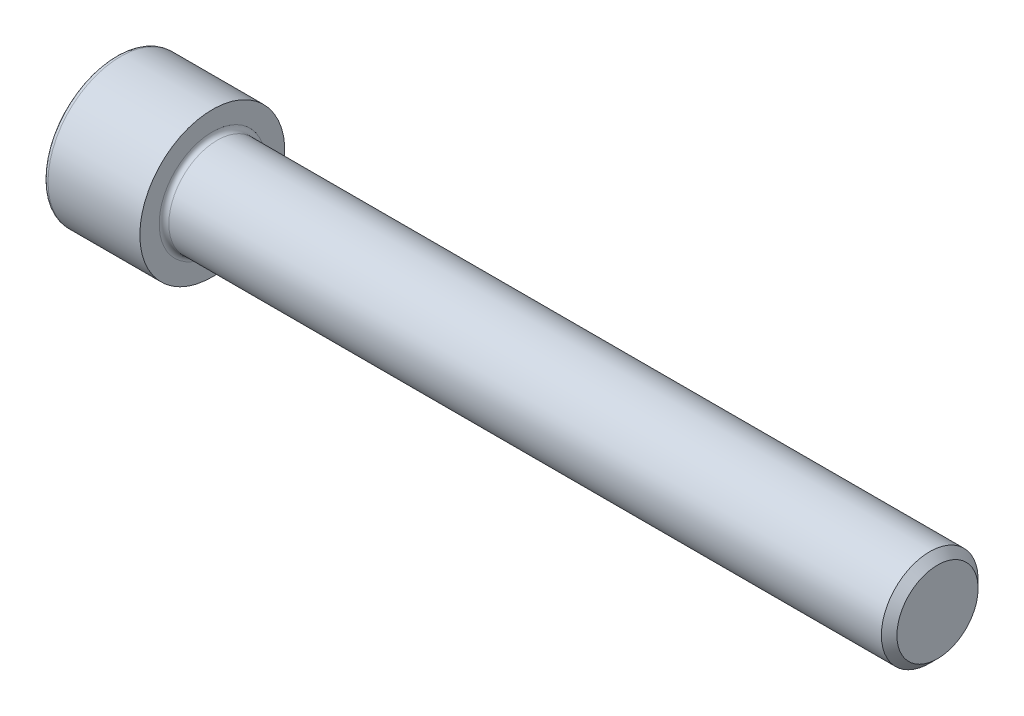
ISO-10303-21;
HEADER;
FILE_DESCRIPTION(('STEP AP214'),'2;1');
FILE_NAME('part.step','',(''),(''),'','','');
FILE_SCHEMA(('AUTOMOTIVE_DESIGN { 1 0 10303 214 1 1 1 1 }'));
ENDSEC;
DATA;
#1=APPLICATION_CONTEXT('core data for automotive mechanical design processes');
#2=APPLICATION_PROTOCOL_DEFINITION('international standard','automotive_design',2000,#1);
#3=PRODUCT_CONTEXT('',#1,'mechanical');
#4=PRODUCT('Part','Part','',(#3));
#5=PRODUCT_RELATED_PRODUCT_CATEGORY('part','',(#4));
#6=PRODUCT_DEFINITION_FORMATION('','',#4);
#7=PRODUCT_DEFINITION_CONTEXT('part definition',#1,'design');
#8=PRODUCT_DEFINITION('design','',#6,#7);
#9=PRODUCT_DEFINITION_SHAPE('','',#8);
#10=(LENGTH_UNIT() NAMED_UNIT(*) SI_UNIT(.MILLI.,.METRE.));
#11=(NAMED_UNIT(*) PLANE_ANGLE_UNIT() SI_UNIT($,.RADIAN.));
#12=(NAMED_UNIT(*) SI_UNIT($,.STERADIAN.) SOLID_ANGLE_UNIT());
#13=UNCERTAINTY_MEASURE_WITH_UNIT(LENGTH_MEASURE(1.E-05),#10,'distance_accuracy_value','');
#14=(GEOMETRIC_REPRESENTATION_CONTEXT(3) GLOBAL_UNCERTAINTY_ASSIGNED_CONTEXT((#13)) GLOBAL_UNIT_ASSIGNED_CONTEXT((#10,
#11,#12)) REPRESENTATION_CONTEXT('',''));
#15=CARTESIAN_POINT('',(0.,0.,0.));
#16=DIRECTION('',(0.,0.,1.));
#17=DIRECTION('',(1.,0.,0.));
#18=AXIS2_PLACEMENT_3D('',#15,#16,#17);
#19=CARTESIAN_POINT('',(0.,0.,0.));
#20=DIRECTION('',(-1.,0.,0.));
#21=DIRECTION('',(0.,0.,1.));
#22=AXIS2_PLACEMENT_3D('',#19,#20,#21);
#23=PLANE('',#22);
#24=DIRECTION('',(0.,-0.499999999999999,0.866025403784439));
#25=VECTOR('',#24,1.);
#26=CARTESIAN_POINT('',(0.,5.83989797285306,0.));
#27=LINE('',#26,#25);
#28=CARTESIAN_POINT('',(0.,5.83989797285306,0.));
#29=VERTEX_POINT('',#28);
#30=CARTESIAN_POINT('',(0.,2.91994898642653,5.0575));
#31=VERTEX_POINT('',#30);
#32=EDGE_CURVE('E259',#29,#31,#27,.T.);
#33=ORIENTED_EDGE('',*,*,#32,.T.);
#34=DIRECTION('',(0.,1.,0.));
#35=VECTOR('',#34,1.);
#36=CARTESIAN_POINT('',(0.,-2.91994898642653,5.0575));
#37=LINE('',#36,#35);
#38=CARTESIAN_POINT('',(0.,-2.91994898642653,5.0575));
#39=VERTEX_POINT('',#38);
#40=EDGE_CURVE('E131',#39,#31,#37,.T.);
#41=ORIENTED_EDGE('',*,*,#40,.F.);
#42=DIRECTION('',(0.,-0.500000000000001,-0.866025403784438));
#43=VECTOR('',#42,1.);
#44=CARTESIAN_POINT('',(0.,-2.91994898642653,5.0575));
#45=LINE('',#44,#43);
#46=CARTESIAN_POINT('',(0.,-5.83989797285307,0.));
#47=VERTEX_POINT('',#46);
#48=EDGE_CURVE('E262',#39,#47,#45,.T.);
#49=ORIENTED_EDGE('',*,*,#48,.T.);
#50=DIRECTION('',(0.,0.499999999999999,-0.866025403784439));
#51=VECTOR('',#50,1.);
#52=CARTESIAN_POINT('',(0.,-5.83989797285307,0.));
#53=LINE('',#52,#51);
#54=CARTESIAN_POINT('',(0.,-2.91994898642654,-5.0575));
#55=VERTEX_POINT('',#54);
#56=EDGE_CURVE('E265',#47,#55,#53,.T.);
#57=ORIENTED_EDGE('',*,*,#56,.T.);
#58=DIRECTION('',(0.,-1.,0.));
#59=VECTOR('',#58,1.);
#60=CARTESIAN_POINT('',(0.,2.91994898642652,-5.0575));
#61=LINE('',#60,#59);
#62=CARTESIAN_POINT('',(0.,2.91994898642652,-5.0575));
#63=VERTEX_POINT('',#62);
#64=EDGE_CURVE('E268',#63,#55,#61,.T.);
#65=ORIENTED_EDGE('',*,*,#64,.F.);
#66=DIRECTION('',(0.,-0.500000000000001,-0.866025403784438));
#67=VECTOR('',#66,1.);
#68=CARTESIAN_POINT('',(0.,5.83989797285306,0.));
#69=LINE('',#68,#67);
#70=EDGE_CURVE('E126',#29,#63,#69,.T.);
#71=ORIENTED_EDGE('',*,*,#70,.F.);
#72=EDGE_LOOP('',(#33,#41,#49,#57,#65,#71));
#73=FACE_BOUND('',#72,.T.);
#74=CARTESIAN_POINT('',(0.,0.,0.));
#75=DIRECTION('',(-1.,0.,0.));
#76=DIRECTION('',(0.,0.,1.));
#77=AXIS2_PLACEMENT_3D('',#74,#75,#76);
#78=CIRCLE('',#77,8.4);
#79=CARTESIAN_POINT('',(0.,0.,8.4));
#80=VERTEX_POINT('',#79);
#81=EDGE_CURVE('E43',#80,#80,#78,.T.);
#82=ORIENTED_EDGE('',*,*,#81,.T.);
#83=EDGE_LOOP('',(#82));
#84=FACE_BOUND('',#83,.T.);
#85=ADVANCED_FACE('F35',(#73,#84),#23,.T.);
#86=CARTESIAN_POINT('',(-31.75,0.,0.));
#87=DIRECTION('',(-1.,0.,0.));
#88=DIRECTION('',(0.,0.,1.));
#89=AXIS2_PLACEMENT_3D('',#86,#87,#88);
#90=CYLINDRICAL_SURFACE('',#89,9.);
#91=CARTESIAN_POINT('',(0.600000000000003,0.,0.));
#92=DIRECTION('',(-1.,0.,0.));
#93=DIRECTION('',(0.,0.,1.));
#94=AXIS2_PLACEMENT_3D('',#91,#92,#93);
#95=CIRCLE('',#94,9.);
#96=CARTESIAN_POINT('',(0.600000000000003,0.,9.));
#97=VERTEX_POINT('',#96);
#98=EDGE_CURVE('E11',#97,#97,#95,.F.);
#99=ORIENTED_EDGE('',*,*,#98,.T.);
#100=EDGE_LOOP('',(#99));
#101=FACE_BOUND('',#100,.T.);
#102=CARTESIAN_POINT('',(12.,0.,0.));
#103=DIRECTION('',(-1.,0.,0.));
#104=DIRECTION('',(0.,0.,1.));
#105=AXIS2_PLACEMENT_3D('',#102,#103,#104);
#106=CIRCLE('',#105,9.);
#107=CARTESIAN_POINT('',(12.,0.,9.));
#108=VERTEX_POINT('',#107);
#109=EDGE_CURVE('E149',#108,#108,#106,.T.);
#110=ORIENTED_EDGE('',*,*,#109,.T.);
#111=EDGE_LOOP('',(#110));
#112=FACE_BOUND('',#111,.T.);
#113=ADVANCED_FACE('F173',(#101,#112),#90,.T.);
#114=CARTESIAN_POINT('',(12.,9.,0.));
#115=DIRECTION('',(1.,0.,0.));
#116=DIRECTION('',(0.,0.,-1.));
#117=AXIS2_PLACEMENT_3D('',#114,#115,#116);
#118=PLANE('',#117);
#119=CARTESIAN_POINT('',(12.,0.,0.));
#120=DIRECTION('',(1.,0.,0.));
#121=DIRECTION('',(0.,0.,-1.));
#122=AXIS2_PLACEMENT_3D('',#119,#120,#121);
#123=CIRCLE('',#122,6.6);
#124=CARTESIAN_POINT('',(12.,0.,-6.6));
#125=VERTEX_POINT('',#124);
#126=EDGE_CURVE('E152',#125,#125,#123,.F.);
#127=ORIENTED_EDGE('',*,*,#126,.T.);
#128=EDGE_LOOP('',(#127));
#129=FACE_BOUND('',#128,.T.);
#130=ORIENTED_EDGE('',*,*,#109,.F.);
#131=EDGE_LOOP('',(#130));
#132=FACE_BOUND('',#131,.T.);
#133=ADVANCED_FACE('F179',(#129,#132),#118,.T.);
#134=CARTESIAN_POINT('',(-31.75,0.,0.));
#135=DIRECTION('',(-1.,0.,0.));
#136=DIRECTION('',(0.,0.,1.));
#137=AXIS2_PLACEMENT_3D('',#134,#135,#136);
#138=CYLINDRICAL_SURFACE('',#137,6.);
#139=CARTESIAN_POINT('',(12.6,0.,0.));
#140=DIRECTION('',(1.,0.,0.));
#141=DIRECTION('',(0.,0.,-1.));
#142=AXIS2_PLACEMENT_3D('',#139,#140,#141);
#143=CIRCLE('',#142,6.);
#144=CARTESIAN_POINT('',(12.6,0.,-6.));
#145=VERTEX_POINT('',#144);
#146=EDGE_CURVE('E155',#145,#145,#143,.T.);
#147=ORIENTED_EDGE('',*,*,#146,.T.);
#148=EDGE_LOOP('',(#147));
#149=FACE_BOUND('',#148,.T.);
#150=CARTESIAN_POINT('',(101.036,0.,0.));
#151=DIRECTION('',(-1.,0.,0.));
#152=DIRECTION('',(0.,0.,1.));
#153=AXIS2_PLACEMENT_3D('',#150,#151,#152);
#154=CIRCLE('',#153,6.);
#155=CARTESIAN_POINT('',(101.036,0.,6.));
#156=VERTEX_POINT('',#155);
#157=EDGE_CURVE('E146',#156,#156,#154,.T.);
#158=ORIENTED_EDGE('',*,*,#157,.T.);
#159=EDGE_LOOP('',(#158));
#160=FACE_BOUND('',#159,.T.);
#161=ADVANCED_FACE('F185',(#149,#160),#138,.T.);
#162=CARTESIAN_POINT('',(102.,0.,0.));
#163=DIRECTION('',(-1.,0.,0.));
#164=DIRECTION('',(0.,0.,1.));
#165=AXIS2_PLACEMENT_3D('',#162,#163,#164);
#166=CONICAL_SURFACE('',#165,5.036,0.785398163397467);
#167=ORIENTED_EDGE('',*,*,#157,.F.);
#168=EDGE_LOOP('',(#167));
#169=FACE_BOUND('',#168,.T.);
#170=CARTESIAN_POINT('',(102.,0.,0.));
#171=DIRECTION('',(-1.,0.,0.));
#172=DIRECTION('',(0.,0.,1.));
#173=AXIS2_PLACEMENT_3D('',#170,#171,#172);
#174=CIRCLE('',#173,5.036);
#175=CARTESIAN_POINT('',(102.,0.,5.036));
#176=VERTEX_POINT('',#175);
#177=EDGE_CURVE('E142',#176,#176,#174,.T.);
#178=ORIENTED_EDGE('',*,*,#177,.T.);
#179=EDGE_LOOP('',(#178));
#180=FACE_BOUND('',#179,.T.);
#181=ADVANCED_FACE('F189',(#169,#180),#166,.T.);
#182=CARTESIAN_POINT('',(102.,5.036,0.));
#183=DIRECTION('',(1.,0.,0.));
#184=DIRECTION('',(0.,0.,-1.));
#185=AXIS2_PLACEMENT_3D('',#182,#183,#184);
#186=PLANE('',#185);
#187=ORIENTED_EDGE('',*,*,#177,.F.);
#188=EDGE_LOOP('',(#187));
#189=FACE_BOUND('',#188,.T.);
#190=ADVANCED_FACE('F169',(#189),#186,.T.);
#191=CARTESIAN_POINT('',(12.6,0.,0.));
#192=DIRECTION('',(1.,0.,0.));
#193=DIRECTION('',(0.,0.,-1.));
#194=AXIS2_PLACEMENT_3D('',#191,#192,#193);
#195=TOROIDAL_SURFACE('',#194,6.6,0.6);
#196=ORIENTED_EDGE('',*,*,#146,.F.);
#197=EDGE_LOOP('',(#196));
#198=FACE_BOUND('',#197,.T.);
#199=ORIENTED_EDGE('',*,*,#126,.F.);
#200=EDGE_LOOP('',(#199));
#201=FACE_BOUND('',#200,.T.);
#202=ADVANCED_FACE('F162',(#198,#201),#195,.F.);
#203=CARTESIAN_POINT('',(0.600000000000003,0.,0.));
#204=DIRECTION('',(-1.,0.,0.));
#205=DIRECTION('',(0.,0.,1.));
#206=AXIS2_PLACEMENT_3D('',#203,#204,#205);
#207=TOROIDAL_SURFACE('',#206,8.4,0.6);
#208=ORIENTED_EDGE('',*,*,#98,.F.);
#209=EDGE_LOOP('',(#208));
#210=FACE_BOUND('',#209,.T.);
#211=ORIENTED_EDGE('',*,*,#81,.F.);
#212=EDGE_LOOP('',(#211));
#213=FACE_BOUND('',#212,.T.);
#214=ADVANCED_FACE('F37',(#210,#213),#207,.T.);
#215=CARTESIAN_POINT('',(6.,5.83989797285306,0.));
#216=DIRECTION('',(0.,-0.866025403784439,-0.499999999999999));
#217=DIRECTION('',(0.,0.499999999999999,-0.866025403784439));
#218=AXIS2_PLACEMENT_3D('',#215,#216,#217);
#219=PLANE('',#218);
#220=ORIENTED_EDGE('',*,*,#32,.F.);
#221=DIRECTION('',(-1.,0.,0.));
#222=VECTOR('',#221,1.);
#223=CARTESIAN_POINT('',(6.,5.83989797285306,0.));
#224=LINE('',#223,#222);
#225=CARTESIAN_POINT('',(6.,5.83989797285306,0.));
#226=VERTEX_POINT('',#225);
#227=EDGE_CURVE('E249',#226,#29,#224,.T.);
#228=ORIENTED_EDGE('',*,*,#227,.F.);
#229=DIRECTION('',(0.,-0.499999999999999,0.866025403784439));
#230=VECTOR('',#229,1.);
#231=CARTESIAN_POINT('',(6.,5.83989797285306,0.));
#232=LINE('',#231,#230);
#233=CARTESIAN_POINT('',(6.,4.3799234796398,2.52874999999999));
#234=VERTEX_POINT('',#233);
#235=EDGE_CURVE('E118',#226,#234,#232,.T.);
#236=ORIENTED_EDGE('',*,*,#235,.T.);
#237=CARTESIAN_POINT('',(6.,2.91994898642653,5.0575));
#238=VERTEX_POINT('',#237);
#239=EDGE_CURVE('E109',#234,#238,#232,.T.);
#240=ORIENTED_EDGE('',*,*,#239,.T.);
#241=DIRECTION('',(-1.,0.,0.));
#242=VECTOR('',#241,1.);
#243=CARTESIAN_POINT('',(6.,2.91994898642653,5.0575));
#244=LINE('',#243,#242);
#245=EDGE_CURVE('E123',#238,#31,#244,.T.);
#246=ORIENTED_EDGE('',*,*,#245,.T.);
#247=EDGE_LOOP('',(#220,#228,#236,#240,#246));
#248=FACE_BOUND('',#247,.T.);
#249=ADVANCED_FACE('F122',(#248),#219,.T.);
#250=CARTESIAN_POINT('',(6.,-2.91994898642653,5.0575));
#251=DIRECTION('',(0.,0.,1.));
#252=DIRECTION('',(0.,-1.,0.));
#253=AXIS2_PLACEMENT_3D('',#250,#251,#252);
#254=PLANE('',#253);
#255=ORIENTED_EDGE('',*,*,#40,.T.);
#256=ORIENTED_EDGE('',*,*,#245,.F.);
#257=DIRECTION('',(0.,1.,0.));
#258=VECTOR('',#257,1.);
#259=CARTESIAN_POINT('',(6.,-2.91994898642653,5.0575));
#260=LINE('',#259,#258);
#261=CARTESIAN_POINT('',(6.,0.,5.0575));
#262=VERTEX_POINT('',#261);
#263=EDGE_CURVE('E106',#262,#238,#260,.T.);
#264=ORIENTED_EDGE('',*,*,#263,.F.);
#265=CARTESIAN_POINT('',(6.,-2.91994898642653,5.0575));
#266=VERTEX_POINT('',#265);
#267=EDGE_CURVE('E117',#266,#262,#260,.T.);
#268=ORIENTED_EDGE('',*,*,#267,.F.);
#269=DIRECTION('',(-1.,0.,0.));
#270=VECTOR('',#269,1.);
#271=CARTESIAN_POINT('',(6.,-2.91994898642653,5.0575));
#272=LINE('',#271,#270);
#273=EDGE_CURVE('E133',#266,#39,#272,.T.);
#274=ORIENTED_EDGE('',*,*,#273,.T.);
#275=EDGE_LOOP('',(#255,#256,#264,#268,#274));
#276=FACE_BOUND('',#275,.T.);
#277=ADVANCED_FACE('F128',(#276),#254,.F.);
#278=CARTESIAN_POINT('',(6.,-2.91994898642653,5.0575));
#279=DIRECTION('',(0.,0.866025403784438,-0.500000000000001));
#280=DIRECTION('',(0.,0.500000000000001,0.866025403784438));
#281=AXIS2_PLACEMENT_3D('',#278,#279,#280);
#282=PLANE('',#281);
#283=ORIENTED_EDGE('',*,*,#48,.F.);
#284=ORIENTED_EDGE('',*,*,#273,.F.);
#285=DIRECTION('',(0.,-0.500000000000001,-0.866025403784438));
#286=VECTOR('',#285,1.);
#287=CARTESIAN_POINT('',(6.,-2.91994898642653,5.0575));
#288=LINE('',#287,#286);
#289=CARTESIAN_POINT('',(6.,-4.3799234796398,2.52875000000001));
#290=VERTEX_POINT('',#289);
#291=EDGE_CURVE('E288',#266,#290,#288,.T.);
#292=ORIENTED_EDGE('',*,*,#291,.T.);
#293=CARTESIAN_POINT('',(6.,-5.83989797285307,0.));
#294=VERTEX_POINT('',#293);
#295=EDGE_CURVE('E277',#290,#294,#288,.T.);
#296=ORIENTED_EDGE('',*,*,#295,.T.);
#297=DIRECTION('',(-1.,0.,0.));
#298=VECTOR('',#297,1.);
#299=CARTESIAN_POINT('',(6.,-5.83989797285307,0.));
#300=LINE('',#299,#298);
#301=EDGE_CURVE('E138',#294,#47,#300,.T.);
#302=ORIENTED_EDGE('',*,*,#301,.T.);
#303=EDGE_LOOP('',(#283,#284,#292,#296,#302));
#304=FACE_BOUND('',#303,.T.);
#305=ADVANCED_FACE('F203',(#304),#282,.T.);
#306=CARTESIAN_POINT('',(6.,-5.83989797285307,0.));
#307=DIRECTION('',(0.,0.866025403784439,0.499999999999999));
#308=DIRECTION('',(0.,-0.499999999999999,0.866025403784439));
#309=AXIS2_PLACEMENT_3D('',#306,#307,#308);
#310=PLANE('',#309);
#311=ORIENTED_EDGE('',*,*,#56,.F.);
#312=ORIENTED_EDGE('',*,*,#301,.F.);
#313=DIRECTION('',(0.,0.499999999999999,-0.866025403784439));
#314=VECTOR('',#313,1.);
#315=CARTESIAN_POINT('',(6.,-5.83989797285307,0.));
#316=LINE('',#315,#314);
#317=CARTESIAN_POINT('',(6.,-4.3799234796398,-2.52875));
#318=VERTEX_POINT('',#317);
#319=EDGE_CURVE('E255',#294,#318,#316,.T.);
#320=ORIENTED_EDGE('',*,*,#319,.T.);
#321=CARTESIAN_POINT('',(6.,-2.91994898642654,-5.0575));
#322=VERTEX_POINT('',#321);
#323=EDGE_CURVE('E287',#318,#322,#316,.T.);
#324=ORIENTED_EDGE('',*,*,#323,.T.);
#325=DIRECTION('',(-1.,0.,0.));
#326=VECTOR('',#325,1.);
#327=CARTESIAN_POINT('',(6.,-2.91994898642654,-5.0575));
#328=LINE('',#327,#326);
#329=EDGE_CURVE('E248',#322,#55,#328,.T.);
#330=ORIENTED_EDGE('',*,*,#329,.T.);
#331=EDGE_LOOP('',(#311,#312,#320,#324,#330));
#332=FACE_BOUND('',#331,.T.);
#333=ADVANCED_FACE('F206',(#332),#310,.T.);
#334=CARTESIAN_POINT('',(6.,2.91994898642652,-5.0575));
#335=DIRECTION('',(0.,0.,-1.));
#336=DIRECTION('',(0.,1.,0.));
#337=AXIS2_PLACEMENT_3D('',#334,#335,#336);
#338=PLANE('',#337);
#339=ORIENTED_EDGE('',*,*,#64,.T.);
#340=ORIENTED_EDGE('',*,*,#329,.F.);
#341=DIRECTION('',(0.,-1.,0.));
#342=VECTOR('',#341,1.);
#343=CARTESIAN_POINT('',(6.,2.91994898642652,-5.0575));
#344=LINE('',#343,#342);
#345=CARTESIAN_POINT('',(6.,0.,-5.0575));
#346=VERTEX_POINT('',#345);
#347=EDGE_CURVE('E252',#346,#322,#344,.T.);
#348=ORIENTED_EDGE('',*,*,#347,.F.);
#349=CARTESIAN_POINT('',(6.,2.91994898642652,-5.0575));
#350=VERTEX_POINT('',#349);
#351=EDGE_CURVE('E50',#350,#346,#344,.T.);
#352=ORIENTED_EDGE('',*,*,#351,.F.);
#353=DIRECTION('',(-1.,0.,0.));
#354=VECTOR('',#353,1.);
#355=CARTESIAN_POINT('',(6.,2.91994898642652,-5.0575));
#356=LINE('',#355,#354);
#357=EDGE_CURVE('E245',#350,#63,#356,.T.);
#358=ORIENTED_EDGE('',*,*,#357,.T.);
#359=EDGE_LOOP('',(#339,#340,#348,#352,#358));
#360=FACE_BOUND('',#359,.T.);
#361=ADVANCED_FACE('F210',(#360),#338,.F.);
#362=CARTESIAN_POINT('',(6.,5.83989797285306,0.));
#363=DIRECTION('',(0.,0.866025403784438,-0.500000000000001));
#364=DIRECTION('',(0.,0.500000000000001,0.866025403784438));
#365=AXIS2_PLACEMENT_3D('',#362,#363,#364);
#366=PLANE('',#365);
#367=ORIENTED_EDGE('',*,*,#70,.T.);
#368=ORIENTED_EDGE('',*,*,#357,.F.);
#369=DIRECTION('',(0.,-0.500000000000001,-0.866025403784438));
#370=VECTOR('',#369,1.);
#371=CARTESIAN_POINT('',(6.,5.83989797285306,0.));
#372=LINE('',#371,#370);
#373=CARTESIAN_POINT('',(6.,4.37992347963979,-2.52875));
#374=VERTEX_POINT('',#373);
#375=EDGE_CURVE('E235',#374,#350,#372,.T.);
#376=ORIENTED_EDGE('',*,*,#375,.F.);
#377=EDGE_CURVE('E241',#226,#374,#372,.T.);
#378=ORIENTED_EDGE('',*,*,#377,.F.);
#379=ORIENTED_EDGE('',*,*,#227,.T.);
#380=EDGE_LOOP('',(#367,#368,#376,#378,#379));
#381=FACE_BOUND('',#380,.T.);
#382=ADVANCED_FACE('F214',(#381),#366,.F.);
#383=CARTESIAN_POINT('',(6.,0.,10.115));
#384=DIRECTION('',(1.,0.,0.));
#385=DIRECTION('',(0.,0.,-1.));
#386=AXIS2_PLACEMENT_3D('',#383,#384,#385);
#387=PLANE('',#386);
#388=ORIENTED_EDGE('',*,*,#347,.T.);
#389=ORIENTED_EDGE('',*,*,#323,.F.);
#390=CARTESIAN_POINT('',(6.,0.,0.));
#391=DIRECTION('',(-1.,0.,0.));
#392=DIRECTION('',(0.,0.,1.));
#393=AXIS2_PLACEMENT_3D('',#390,#391,#392);
#394=CIRCLE('',#393,5.0575);
#395=EDGE_CURVE('E283',#346,#318,#394,.T.);
#396=ORIENTED_EDGE('',*,*,#395,.F.);
#397=EDGE_LOOP('',(#388,#389,#396));
#398=FACE_BOUND('',#397,.T.);
#399=ADVANCED_FACE('F218',(#398),#387,.F.);
#400=ORIENTED_EDGE('',*,*,#319,.F.);
#401=ORIENTED_EDGE('',*,*,#295,.F.);
#402=EDGE_CURVE('E136',#318,#290,#394,.T.);
#403=ORIENTED_EDGE('',*,*,#402,.F.);
#404=EDGE_LOOP('',(#400,#401,#403));
#405=FACE_BOUND('',#404,.T.);
#406=ADVANCED_FACE('F221',(#405),#387,.F.);
#407=ORIENTED_EDGE('',*,*,#291,.F.);
#408=ORIENTED_EDGE('',*,*,#267,.T.);
#409=EDGE_CURVE('E132',#290,#262,#394,.T.);
#410=ORIENTED_EDGE('',*,*,#409,.F.);
#411=EDGE_LOOP('',(#407,#408,#410));
#412=FACE_BOUND('',#411,.T.);
#413=ADVANCED_FACE('F226',(#412),#387,.F.);
#414=ORIENTED_EDGE('',*,*,#263,.T.);
#415=ORIENTED_EDGE('',*,*,#239,.F.);
#416=EDGE_CURVE('E112',#262,#234,#394,.T.);
#417=ORIENTED_EDGE('',*,*,#416,.F.);
#418=EDGE_LOOP('',(#414,#415,#417));
#419=FACE_BOUND('',#418,.T.);
#420=ADVANCED_FACE('F108',(#419),#387,.F.);
#421=ORIENTED_EDGE('',*,*,#235,.F.);
#422=ORIENTED_EDGE('',*,*,#377,.T.);
#423=EDGE_CURVE('E143',#234,#374,#394,.T.);
#424=ORIENTED_EDGE('',*,*,#423,.F.);
#425=EDGE_LOOP('',(#421,#422,#424));
#426=FACE_BOUND('',#425,.T.);
#427=ADVANCED_FACE('F229',(#426),#387,.F.);
#428=ORIENTED_EDGE('',*,*,#375,.T.);
#429=ORIENTED_EDGE('',*,*,#351,.T.);
#430=EDGE_CURVE('E238',#374,#346,#394,.T.);
#431=ORIENTED_EDGE('',*,*,#430,.F.);
#432=EDGE_LOOP('',(#428,#429,#431));
#433=FACE_BOUND('',#432,.T.);
#434=ADVANCED_FACE('F199',(#433),#387,.F.);
#435=CARTESIAN_POINT('',(6.,0.,0.));
#436=DIRECTION('',(-1.,0.,0.));
#437=DIRECTION('',(0.,0.,1.));
#438=AXIS2_PLACEMENT_3D('',#435,#436,#437);
#439=CONICAL_SURFACE('',#438,5.0575,1.04719755119659);
#440=CARTESIAN_POINT('',(8.91994898642657,0.,0.));
#441=VERTEX_POINT('',#440);
#442=VERTEX_LOOP('',#441);
#443=FACE_BOUND('',#442,.T.);
#444=ORIENTED_EDGE('',*,*,#416,.T.);
#445=ORIENTED_EDGE('',*,*,#423,.T.);
#446=ORIENTED_EDGE('',*,*,#430,.T.);
#447=ORIENTED_EDGE('',*,*,#395,.T.);
#448=ORIENTED_EDGE('',*,*,#402,.T.);
#449=ORIENTED_EDGE('',*,*,#409,.T.);
#450=EDGE_LOOP('',(#444,#445,#446,#447,#448,#449));
#451=FACE_BOUND('',#450,.T.);
#452=ADVANCED_FACE('F197',(#443,#451),#439,.F.);
#453=CLOSED_SHELL('',(#85,#113,#133,#161,#181,#190,#202,#214,#249,#277,#305,#333,#361,#382,#399,
#406,#413,#420,#427,#434,#452));
#454=MANIFOLD_SOLID_BREP('B2',#453);
#455=ADVANCED_BREP_SHAPE_REPRESENTATION('',(#18,#454),#14);
#456=SHAPE_DEFINITION_REPRESENTATION(#9,#455);
ENDSEC;
END-ISO-10303-21;
